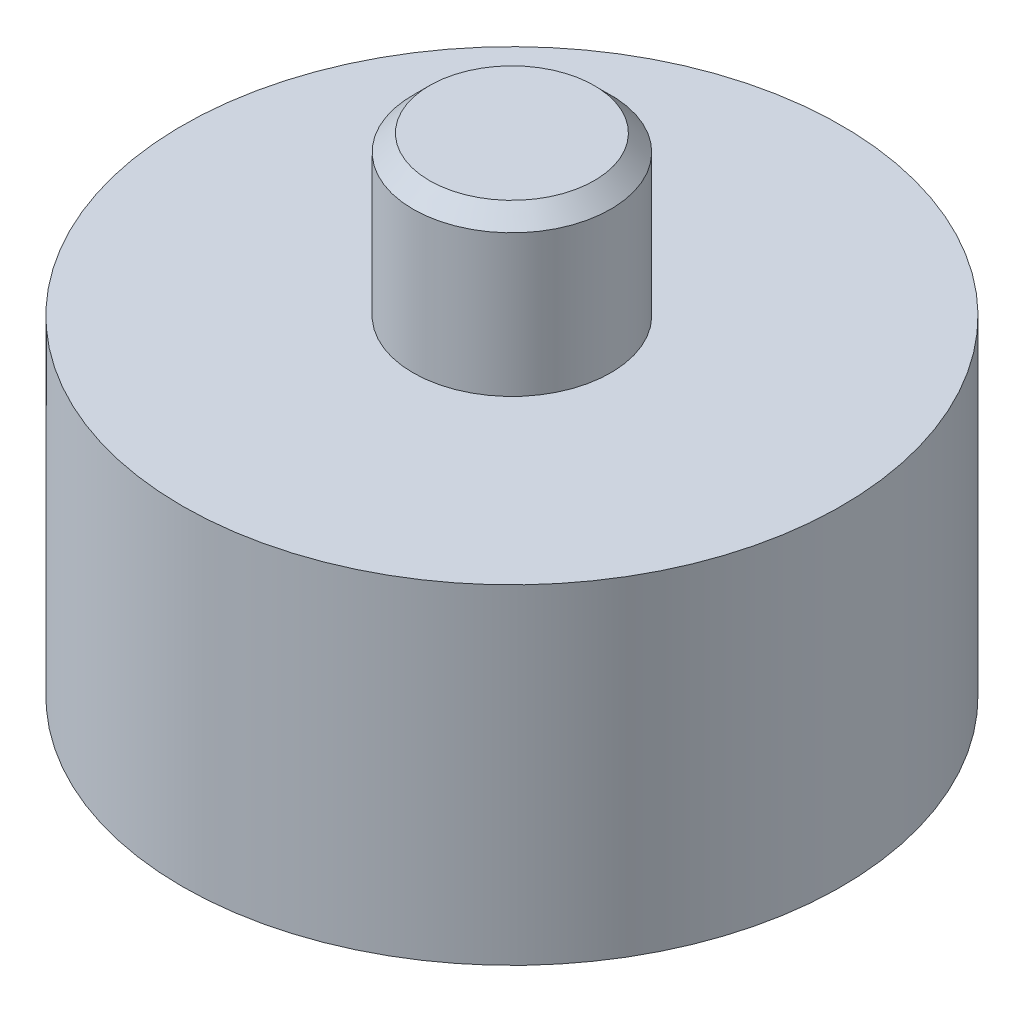
ISO-10303-21;
HEADER;
FILE_DESCRIPTION(('STEP AP214'),'2;1');
FILE_NAME('part.step','',(''),(''),'','','');
FILE_SCHEMA(('AUTOMOTIVE_DESIGN { 1 0 10303 214 1 1 1 1 }'));
ENDSEC;
DATA;
#1=APPLICATION_CONTEXT('core data for automotive mechanical design processes');
#2=APPLICATION_PROTOCOL_DEFINITION('international standard','automotive_design',2000,#1);
#3=PRODUCT_CONTEXT('',#1,'mechanical');
#4=PRODUCT('Part','Part','',(#3));
#5=PRODUCT_RELATED_PRODUCT_CATEGORY('part','',(#4));
#6=PRODUCT_DEFINITION_FORMATION('','',#4);
#7=PRODUCT_DEFINITION_CONTEXT('part definition',#1,'design');
#8=PRODUCT_DEFINITION('design','',#6,#7);
#9=PRODUCT_DEFINITION_SHAPE('','',#8);
#10=(LENGTH_UNIT() NAMED_UNIT(*) SI_UNIT(.MILLI.,.METRE.));
#11=(NAMED_UNIT(*) PLANE_ANGLE_UNIT() SI_UNIT($,.RADIAN.));
#12=(NAMED_UNIT(*) SI_UNIT($,.STERADIAN.) SOLID_ANGLE_UNIT());
#13=UNCERTAINTY_MEASURE_WITH_UNIT(LENGTH_MEASURE(1.E-05),#10,'distance_accuracy_value','');
#14=(GEOMETRIC_REPRESENTATION_CONTEXT(3) GLOBAL_UNCERTAINTY_ASSIGNED_CONTEXT((#13)) GLOBAL_UNIT_ASSIGNED_CONTEXT((#10,
#11,#12)) REPRESENTATION_CONTEXT('',''));
#15=CARTESIAN_POINT('',(0.,0.,0.));
#16=DIRECTION('',(0.,0.,1.));
#17=DIRECTION('',(1.,0.,0.));
#18=AXIS2_PLACEMENT_3D('',#15,#16,#17);
#19=CARTESIAN_POINT('',(0.,10.,0.));
#20=DIRECTION('',(0.,-1.,0.));
#21=DIRECTION('',(0.,0.,-1.));
#22=AXIS2_PLACEMENT_3D('',#19,#20,#21);
#23=CYLINDRICAL_SURFACE('',#22,10.);
#24=CARTESIAN_POINT('',(0.,8.,-10.));
#25=CARTESIAN_POINT('',(-0.1645772255066,7.99999800503023,-9.99999858501101));
#26=CARTESIAN_POINT('',(-0.329174636703059,7.98641227275207,-9.99589831387907));
#27=CARTESIAN_POINT('',(-0.653576250609762,7.9325572915558,-9.97994211187382));
#28=CARTESIAN_POINT('',(-0.81337900882284,7.89228008395332,-9.96808386779384));
#29=CARTESIAN_POINT('',(-1.12346541550905,7.78650796617947,-9.93791105003673));
#30=CARTESIAN_POINT('',(-1.27376272879075,7.72105026076213,-9.91960600500851));
#31=CARTESIAN_POINT('',(-1.56124836210626,7.56692781388833,-9.87844218475291));
#32=CARTESIAN_POINT('',(-1.69843493493934,7.47825998520917,-9.85558280384133));
#33=CARTESIAN_POINT('',(-1.95974359436749,7.27755198505466,-9.80701474385548));
#34=CARTESIAN_POINT('',(-2.08343614248868,7.16496674822817,-9.78124767314073));
#35=CARTESIAN_POINT('',(-2.31049841846647,6.92078154017963,-9.73011668420884));
#36=CARTESIAN_POINT('',(-2.41386472654882,6.78917837575008,-9.70475283449003));
#37=CARTESIAN_POINT('',(-2.59960075447415,6.50705849392478,-9.65668227987544));
#38=CARTESIAN_POINT('',(-2.68144618044427,6.35618307801852,-9.63404813327749));
#39=CARTESIAN_POINT('',(-2.81842789549521,6.04202149153941,-9.59487240788062));
#40=CARTESIAN_POINT('',(-2.87357059839946,5.87873831214405,-9.57832936626621));
#41=CARTESIAN_POINT('',(-2.95403267365303,5.54921946773908,-9.55381741676868));
#42=CARTESIAN_POINT('',(-2.98014392469355,5.38319451227211,-9.54562138649067));
#43=CARTESIAN_POINT('',(-3.00427461229344,5.04893368756647,-9.53805579499534));
#44=CARTESIAN_POINT('',(-3.00230085522157,4.88069836388182,-9.53868409521142));
#45=CARTESIAN_POINT('',(-2.97093954399623,4.55323218278303,-9.54849488135555));
#46=CARTESIAN_POINT('',(-2.9425441052537,4.39389549927552,-9.55736777198281));
#47=CARTESIAN_POINT('',(-2.86074840854112,4.08236042745308,-9.58216712457248));
#48=CARTESIAN_POINT('',(-2.80734568283282,3.93016274525133,-9.59809428264701));
#49=CARTESIAN_POINT('',(-2.67632053307363,3.63479930067852,-9.63545466149946));
#50=CARTESIAN_POINT('',(-2.59837633869285,3.49178583208948,-9.65696032231904));
#51=CARTESIAN_POINT('',(-2.42070445177367,3.22053595597962,-9.70301974000129));
#52=CARTESIAN_POINT('',(-2.32097148005177,3.09230314117244,-9.72757423493982));
#53=CARTESIAN_POINT('',(-2.09762581531093,2.84862761847596,-9.77822022595875));
#54=CARTESIAN_POINT('',(-1.97318981493394,2.73394267194066,-9.80433308620996));
#55=CARTESIAN_POINT('',(-1.70652651862793,2.5268920318715,-9.85424488126517));
#56=CARTESIAN_POINT('',(-1.56429810372178,2.43452774317115,-9.8780436703682));
#57=CARTESIAN_POINT('',(-1.26471007668561,2.27428015507054,-9.92086320138941));
#58=CARTESIAN_POINT('',(-1.1072554994959,2.20656496750028,-9.93985087336628));
#59=CARTESIAN_POINT('',(-0.782490831207038,2.09880081980074,-9.97067043664444));
#60=CARTESIAN_POINT('',(-0.615183503179163,2.05874414293502,-9.98250432373999));
#61=CARTESIAN_POINT('',(-0.281904485336664,2.00869564420121,-9.99736729287077));
#62=CARTESIAN_POINT('',(-0.116100195202375,1.99767682839678,-10.0006970083558));
#63=CARTESIAN_POINT('',(0.214999211646765,2.00313831142416,-9.99905846483519));
#64=CARTESIAN_POINT('',(0.380294393381561,2.01961493930288,-9.99409131355514));
#65=CARTESIAN_POINT('',(0.701807210619393,2.07876922222299,-9.97661393974325));
#66=CARTESIAN_POINT('',(0.858145545228337,2.12084677516174,-9.96427659598829));
#67=CARTESIAN_POINT('',(1.16150927790904,2.2292864655564,-9.9334869568307));
#68=CARTESIAN_POINT('',(1.30853355405117,2.29565152207572,-9.91503392642188));
#69=CARTESIAN_POINT('',(1.5928743789221,2.45250633096227,-9.87339308702631));
#70=CARTESIAN_POINT('',(1.72988765239933,2.54351868189596,-9.8501056165928));
#71=CARTESIAN_POINT('',(1.9870466159603,2.74644950810561,-9.80146937528705));
#72=CARTESIAN_POINT('',(2.10718806471188,2.8583732237753,-9.7761200886242));
#73=CARTESIAN_POINT('',(2.33171489102052,3.10477461673874,-9.72506343738007));
#74=CARTESIAN_POINT('',(2.43536962463001,3.23992375154365,-9.69937650065513));
#75=CARTESIAN_POINT('',(2.61857990144313,3.52625587802688,-9.65153030477949));
#76=CARTESIAN_POINT('',(2.69813607658965,3.67743844911576,-9.62937095313121));
#77=CARTESIAN_POINT('',(2.83034694254316,3.99106498251004,-9.5913437922631));
#78=CARTESIAN_POINT('',(2.88312693874021,4.15345237307567,-9.57544675673501));
#79=CARTESIAN_POINT('',(2.96043461630306,4.48537593786047,-9.55183188739737));
#80=CARTESIAN_POINT('',(2.98497197957849,4.65490964156607,-9.54411125069387));
#81=CARTESIAN_POINT('',(3.0044396896993,4.98872303677684,-9.53799944941558));
#82=CARTESIAN_POINT('',(3.00056110615887,5.15292730209884,-9.53923294700395));
#83=CARTESIAN_POINT('',(2.9661501088861,5.47822820680123,-9.54998802392188));
#84=CARTESIAN_POINT('',(2.93561876249408,5.63932497036102,-9.55950927135902));
#85=CARTESIAN_POINT('',(2.84953777608686,5.95189079826335,-9.58551527389243));
#86=CARTESIAN_POINT('',(2.79430351014248,6.10345457471739,-9.60191209104934));
#87=CARTESIAN_POINT('',(2.66063014242147,6.39528487764145,-9.63980557805265));
#88=CARTESIAN_POINT('',(2.58218659925722,6.53554923528315,-9.6613032238508));
#89=CARTESIAN_POINT('',(2.40097527610175,6.80632623305253,-9.70795352855338));
#90=CARTESIAN_POINT('',(2.29742552185996,6.93629752252037,-9.7332108032858));
#91=CARTESIAN_POINT('',(2.07034869259555,7.17740499661618,-9.78402640899066));
#92=CARTESIAN_POINT('',(1.94681643426898,7.28853627893564,-9.80958481647543));
#93=CARTESIAN_POINT('',(1.67893152436652,7.49204682458993,-9.85901873141573));
#94=CARTESIAN_POINT('',(1.53407577158122,7.58378289371094,-9.88282319531421));
#95=CARTESIAN_POINT('',(1.23028274796705,7.74147033980808,-9.92521360911553));
#96=CARTESIAN_POINT('',(1.07135210599791,7.80743377654903,-9.94380199862114));
#97=CARTESIAN_POINT('',(0.761515425310564,7.90579055130549,-9.97204349938619));
#98=CARTESIAN_POINT('',(0.611573923908469,7.94102334576649,-9.9824405476214));
#99=CARTESIAN_POINT('',(0.307760390461558,7.98812705048316,-9.9964188898898));
#100=CARTESIAN_POINT('',(0.153889019716279,8.00000186540964,-10.0000013230948));
#101=CARTESIAN_POINT('',(0.,8.,-10.));
#102=B_SPLINE_CURVE_WITH_KNOTS('',3,(#24,#25,#26,#27,#28,#29,#30,#31,#32,#33,#34,#35,#36,#37,
#38,#39,#40,#41,#42,#43,#44,#45,#46,#47,#48,#49,#50,#51,#52,#53,#54,#55,#56,#57,#58,#59,#60,#61,
#62,#63,#64,#65,#66,#67,#68,#69,#70,#71,#72,#73,#74,#75,#76,#77,#78,#79,#80,#81,#82,#83,#84,#85,
#86,#87,#88,#89,#90,#91,#92,#93,#94,#95,#96,#97,#98,#99,#100,#101),.UNSPECIFIED.,.T.,.F.,(4,2,2,
2,2,2,2,2,2,2,2,2,2,2,2,2,2,2,2,2,2,2,2,2,2,2,2,2,2,2,2,2,2,2,2,2,2,2,4),(0.,0.493166407225221,
0.986479929691999,1.47906735260175,1.9717203288254,2.47711205896383,2.98258874577266,
3.49942962008218,4.01614629086447,4.51839378713198,5.02051956638179,5.50452033395352,
5.98856887316002,6.47924852894239,6.97004720317111,7.48134208096333,7.99266913062143,
8.50742093763377,9.02202907057615,9.5181761887709,10.0142570710065,10.4991349336465,
10.9840710918746,11.4802261140582,11.9765056400038,12.4908080064564,13.0050968850536,
13.516956299025,14.0286401892057,14.5190031093854,15.0093463933232,15.4936008081456,
15.9779479511533,16.4799385136898,16.9820594980412,17.4988599232246,18.0154182319959,
18.4766338387004,18.9377723390687),.UNSPECIFIED.);
#103=CARTESIAN_POINT('',(0.,8.,-10.));
#104=VERTEX_POINT('',#103);
#105=EDGE_CURVE('E66',#104,#104,#102,.T.);
#106=ORIENTED_EDGE('',*,*,#105,.T.);
#107=EDGE_LOOP('',(#106));
#108=FACE_BOUND('',#107,.T.);
#109=CARTESIAN_POINT('',(0.,10.,0.));
#110=DIRECTION('',(0.,1.,0.));
#111=DIRECTION('',(0.,0.,1.));
#112=AXIS2_PLACEMENT_3D('',#109,#110,#111);
#113=CIRCLE('',#112,10.);
#114=CARTESIAN_POINT('',(0.,10.,10.));
#115=VERTEX_POINT('',#114);
#116=EDGE_CURVE('E117',#115,#115,#113,.T.);
#117=ORIENTED_EDGE('',*,*,#116,.F.);
#118=EDGE_LOOP('',(#117));
#119=FACE_BOUND('',#118,.T.);
#120=CARTESIAN_POINT('',(0.,0.,0.));
#121=DIRECTION('',(0.,1.,0.));
#122=DIRECTION('',(0.,0.,1.));
#123=AXIS2_PLACEMENT_3D('',#120,#121,#122);
#124=CIRCLE('',#123,10.);
#125=CARTESIAN_POINT('',(0.,0.,10.));
#126=VERTEX_POINT('',#125);
#127=EDGE_CURVE('E120',#126,#126,#124,.T.);
#128=ORIENTED_EDGE('',*,*,#127,.T.);
#129=EDGE_LOOP('',(#128));
#130=FACE_BOUND('',#129,.T.);
#131=ADVANCED_FACE('F41',(#108,#119,#130),#23,.T.);
#132=CARTESIAN_POINT('',(0.,10.,0.));
#133=DIRECTION('',(0.,1.,0.));
#134=DIRECTION('',(0.,0.,1.));
#135=AXIS2_PLACEMENT_3D('',#132,#133,#134);
#136=PLANE('',#135);
#137=CARTESIAN_POINT('',(0.,10.,0.));
#138=DIRECTION('',(0.,1.,0.));
#139=DIRECTION('',(0.,0.,1.));
#140=AXIS2_PLACEMENT_3D('',#137,#138,#139);
#141=CIRCLE('',#140,3.);
#142=CARTESIAN_POINT('',(0.,10.,3.));
#143=VERTEX_POINT('',#142);
#144=EDGE_CURVE('E75',#143,#143,#141,.T.);
#145=ORIENTED_EDGE('',*,*,#144,.F.);
#146=EDGE_LOOP('',(#145));
#147=FACE_BOUND('',#146,.T.);
#148=ORIENTED_EDGE('',*,*,#116,.T.);
#149=EDGE_LOOP('',(#148));
#150=FACE_BOUND('',#149,.T.);
#151=ADVANCED_FACE('F99',(#147,#150),#136,.T.);
#152=CARTESIAN_POINT('',(0.,0.,0.));
#153=DIRECTION('',(0.,1.,0.));
#154=DIRECTION('',(0.,0.,1.));
#155=AXIS2_PLACEMENT_3D('',#152,#153,#154);
#156=PLANE('',#155);
#157=CARTESIAN_POINT('',(0.,0.,0.));
#158=DIRECTION('',(0.,1.,0.));
#159=DIRECTION('',(0.,0.,1.));
#160=AXIS2_PLACEMENT_3D('',#157,#158,#159);
#161=CIRCLE('',#160,3.);
#162=CARTESIAN_POINT('',(0.,0.,3.));
#163=VERTEX_POINT('',#162);
#164=EDGE_CURVE('E76',#163,#163,#161,.T.);
#165=ORIENTED_EDGE('',*,*,#164,.T.);
#166=EDGE_LOOP('',(#165));
#167=FACE_BOUND('',#166,.T.);
#168=ORIENTED_EDGE('',*,*,#127,.F.);
#169=EDGE_LOOP('',(#168));
#170=FACE_BOUND('',#169,.T.);
#171=ADVANCED_FACE('F92',(#167,#170),#156,.F.);
#172=CARTESIAN_POINT('',(0.,-4.8,0.));
#173=DIRECTION('',(0.,-1.,0.));
#174=DIRECTION('',(0.,0.,-1.));
#175=AXIS2_PLACEMENT_3D('',#172,#173,#174);
#176=PLANE('',#175);
#177=CARTESIAN_POINT('',(0.,-4.8,0.));
#178=DIRECTION('',(0.,-1.,0.));
#179=DIRECTION('',(0.,0.,-1.));
#180=AXIS2_PLACEMENT_3D('',#177,#178,#179);
#181=CIRCLE('',#180,2.5);
#182=CARTESIAN_POINT('',(0.,-4.8,-2.5));
#183=VERTEX_POINT('',#182);
#184=EDGE_CURVE('E60',#183,#183,#181,.T.);
#185=ORIENTED_EDGE('',*,*,#184,.T.);
#186=EDGE_LOOP('',(#185));
#187=FACE_BOUND('',#186,.T.);
#188=ADVANCED_FACE('F88',(#187),#176,.T.);
#189=CARTESIAN_POINT('',(0.,28.0852813742386,0.));
#190=DIRECTION('',(0.,-1.,0.));
#191=DIRECTION('',(0.,0.,-1.));
#192=AXIS2_PLACEMENT_3D('',#189,#190,#191);
#193=CYLINDRICAL_SURFACE('',#192,3.);
#194=CARTESIAN_POINT('',(0.,-4.3,0.));
#195=DIRECTION('',(0.,-1.,0.));
#196=DIRECTION('',(0.,0.,-1.));
#197=AXIS2_PLACEMENT_3D('',#194,#195,#196);
#198=CIRCLE('',#197,3.);
#199=CARTESIAN_POINT('',(0.,-4.3,-3.));
#200=VERTEX_POINT('',#199);
#201=EDGE_CURVE('E55',#200,#200,#198,.F.);
#202=ORIENTED_EDGE('',*,*,#201,.T.);
#203=EDGE_LOOP('',(#202));
#204=FACE_BOUND('',#203,.T.);
#205=ORIENTED_EDGE('',*,*,#164,.F.);
#206=EDGE_LOOP('',(#205));
#207=FACE_BOUND('',#206,.T.);
#208=ADVANCED_FACE('F91',(#204,#207),#193,.T.);
#209=CARTESIAN_POINT('',(0.,14.8,0.));
#210=DIRECTION('',(0.,1.,0.));
#211=DIRECTION('',(0.,0.,1.));
#212=AXIS2_PLACEMENT_3D('',#209,#210,#211);
#213=PLANE('',#212);
#214=CARTESIAN_POINT('',(0.,14.8,0.));
#215=DIRECTION('',(0.,1.,0.));
#216=DIRECTION('',(0.,0.,1.));
#217=AXIS2_PLACEMENT_3D('',#214,#215,#216);
#218=CIRCLE('',#217,2.49999999999999);
#219=CARTESIAN_POINT('',(0.,14.8,2.49999999999999));
#220=VERTEX_POINT('',#219);
#221=EDGE_CURVE('E11',#220,#220,#218,.T.);
#222=ORIENTED_EDGE('',*,*,#221,.T.);
#223=EDGE_LOOP('',(#222));
#224=FACE_BOUND('',#223,.T.);
#225=ADVANCED_FACE('F96',(#224),#213,.T.);
#226=CARTESIAN_POINT('',(0.,14.3,0.));
#227=DIRECTION('',(0.,1.,0.));
#228=DIRECTION('',(0.,0.,1.));
#229=AXIS2_PLACEMENT_3D('',#226,#227,#228);
#230=CIRCLE('',#229,3.);
#231=CARTESIAN_POINT('',(0.,14.3,3.));
#232=VERTEX_POINT('',#231);
#233=EDGE_CURVE('E50',#232,#232,#230,.F.);
#234=ORIENTED_EDGE('',*,*,#233,.T.);
#235=EDGE_LOOP('',(#234));
#236=FACE_BOUND('',#235,.T.);
#237=ORIENTED_EDGE('',*,*,#144,.T.);
#238=EDGE_LOOP('',(#237));
#239=FACE_BOUND('',#238,.T.);
#240=ADVANCED_FACE('F86',(#236,#239),#193,.T.);
#241=CARTESIAN_POINT('',(0.,5.,-10.));
#242=DIRECTION('',(0.,0.,1.));
#243=DIRECTION('',(1.,0.,0.));
#244=AXIS2_PLACEMENT_3D('',#241,#242,#243);
#245=CYLINDRICAL_SURFACE('',#244,3.);
#246=CARTESIAN_POINT('',(0.,5.,-0.5));
#247=DIRECTION('',(0.,0.,1.));
#248=DIRECTION('',(1.,0.,0.));
#249=AXIS2_PLACEMENT_3D('',#246,#247,#248);
#250=CIRCLE('',#249,3.);
#251=CARTESIAN_POINT('',(3.,5.,-0.5));
#252=VERTEX_POINT('',#251);
#253=EDGE_CURVE('E125',#252,#252,#250,.T.);
#254=ORIENTED_EDGE('',*,*,#253,.T.);
#255=EDGE_LOOP('',(#254));
#256=FACE_BOUND('',#255,.T.);
#257=ORIENTED_EDGE('',*,*,#105,.F.);
#258=EDGE_LOOP('',(#257));
#259=FACE_BOUND('',#258,.T.);
#260=ADVANCED_FACE('F80',(#256,#259),#245,.F.);
#261=CARTESIAN_POINT('',(0.,5.,-0.5));
#262=DIRECTION('',(0.,0.,1.));
#263=DIRECTION('',(1.,0.,0.));
#264=AXIS2_PLACEMENT_3D('',#261,#262,#263);
#265=PLANE('',#264);
#266=ORIENTED_EDGE('',*,*,#253,.F.);
#267=EDGE_LOOP('',(#266));
#268=FACE_BOUND('',#267,.T.);
#269=ADVANCED_FACE('F85',(#268),#265,.F.);
#270=CARTESIAN_POINT('',(0.,-4.8,0.));
#271=DIRECTION('',(0.,1.,0.));
#272=DIRECTION('',(0.,0.,1.));
#273=AXIS2_PLACEMENT_3D('',#270,#271,#272);
#274=CONICAL_SURFACE('',#273,2.5,0.78539816339745);
#275=ORIENTED_EDGE('',*,*,#201,.F.);
#276=EDGE_LOOP('',(#275));
#277=FACE_BOUND('',#276,.T.);
#278=ORIENTED_EDGE('',*,*,#184,.F.);
#279=EDGE_LOOP('',(#278));
#280=FACE_BOUND('',#279,.T.);
#281=ADVANCED_FACE('F136',(#277,#280),#274,.T.);
#282=CARTESIAN_POINT('',(0.,14.3,0.));
#283=DIRECTION('',(0.,-1.,0.));
#284=DIRECTION('',(0.,0.,-1.));
#285=AXIS2_PLACEMENT_3D('',#282,#283,#284);
#286=CONICAL_SURFACE('',#285,3.,0.785398163397453);
#287=ORIENTED_EDGE('',*,*,#221,.F.);
#288=EDGE_LOOP('',(#287));
#289=FACE_BOUND('',#288,.T.);
#290=ORIENTED_EDGE('',*,*,#233,.F.);
#291=EDGE_LOOP('',(#290));
#292=FACE_BOUND('',#291,.T.);
#293=ADVANCED_FACE('F44',(#289,#292),#286,.T.);
#294=CLOSED_SHELL('',(#131,#151,#171,#188,#208,#225,#240,#260,#269,#281,#293));
#295=MANIFOLD_SOLID_BREP('B2',#294);
#296=ADVANCED_BREP_SHAPE_REPRESENTATION('',(#18,#295),#14);
#297=SHAPE_DEFINITION_REPRESENTATION(#9,#296);
ENDSEC;
END-ISO-10303-21;
